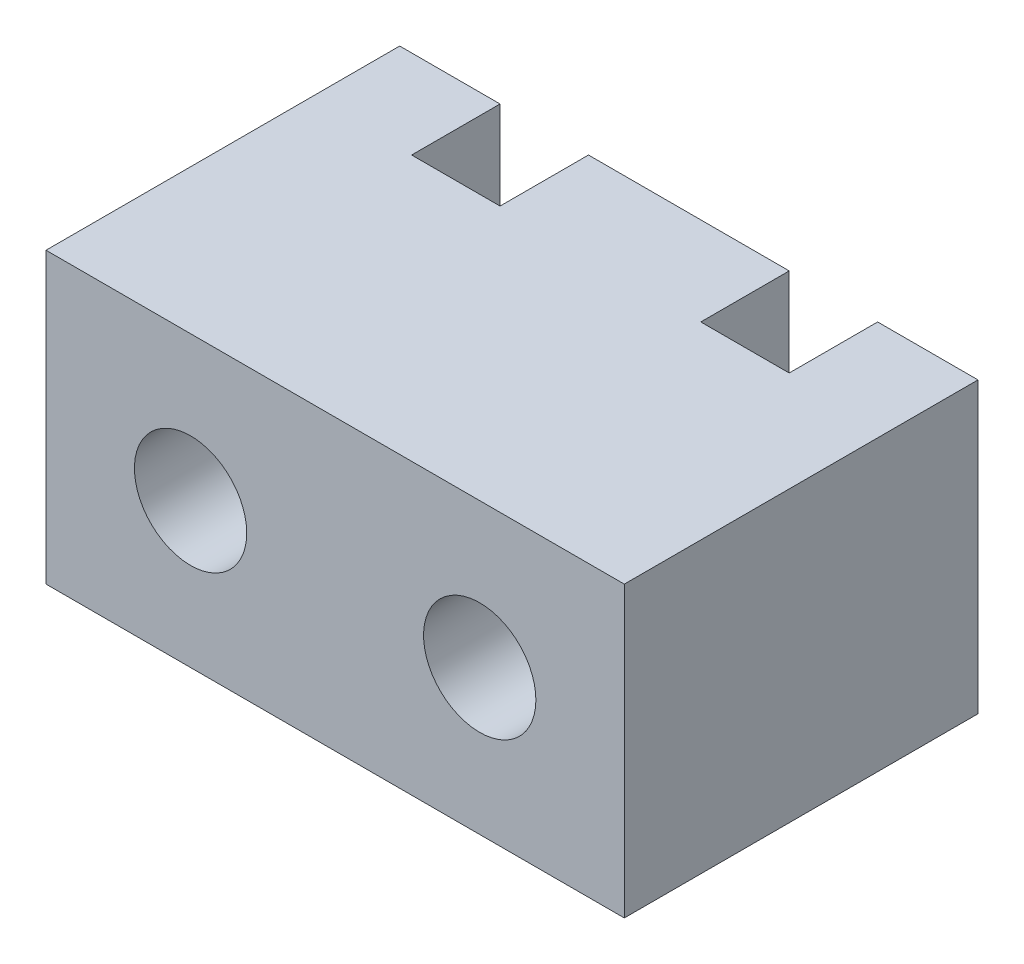
ISO-10303-21;
HEADER;
FILE_DESCRIPTION(('STEP AP214'),'2;1');
FILE_NAME('part.step','',(''),(''),'','','');
FILE_SCHEMA(('AUTOMOTIVE_DESIGN { 1 0 10303 214 1 1 1 1 }'));
ENDSEC;
DATA;
#1=APPLICATION_CONTEXT('core data for automotive mechanical design processes');
#2=APPLICATION_PROTOCOL_DEFINITION('international standard','automotive_design',2000,#1);
#3=PRODUCT_CONTEXT('',#1,'mechanical');
#4=PRODUCT('Part','Part','',(#3));
#5=PRODUCT_RELATED_PRODUCT_CATEGORY('part','',(#4));
#6=PRODUCT_DEFINITION_FORMATION('','',#4);
#7=PRODUCT_DEFINITION_CONTEXT('part definition',#1,'design');
#8=PRODUCT_DEFINITION('design','',#6,#7);
#9=PRODUCT_DEFINITION_SHAPE('','',#8);
#10=(LENGTH_UNIT() NAMED_UNIT(*) SI_UNIT(.MILLI.,.METRE.));
#11=(NAMED_UNIT(*) PLANE_ANGLE_UNIT() SI_UNIT($,.RADIAN.));
#12=(NAMED_UNIT(*) SI_UNIT($,.STERADIAN.) SOLID_ANGLE_UNIT());
#13=UNCERTAINTY_MEASURE_WITH_UNIT(LENGTH_MEASURE(1.E-05),#10,'distance_accuracy_value','');
#14=(GEOMETRIC_REPRESENTATION_CONTEXT(3) GLOBAL_UNCERTAINTY_ASSIGNED_CONTEXT((#13)) GLOBAL_UNIT_ASSIGNED_CONTEXT((#10,
#11,#12)) REPRESENTATION_CONTEXT('',''));
#15=CARTESIAN_POINT('',(0.,0.,0.));
#16=DIRECTION('',(0.,0.,1.));
#17=DIRECTION('',(1.,0.,0.));
#18=AXIS2_PLACEMENT_3D('',#15,#16,#17);
#19=CARTESIAN_POINT('',(0.,0.,-10.));
#20=DIRECTION('',(0.,0.,-1.));
#21=DIRECTION('',(-1.,0.,0.));
#22=AXIS2_PLACEMENT_3D('',#19,#20,#21);
#23=PLANE('',#22);
#24=DIRECTION('',(0.,-1.,0.));
#25=VECTOR('',#24,1.);
#26=CARTESIAN_POINT('',(10.675,8.175,-10.));
#27=LINE('',#26,#25);
#28=CARTESIAN_POINT('',(10.675,8.175,-10.));
#29=VERTEX_POINT('',#28);
#30=CARTESIAN_POINT('',(10.675,1.95719825260498,-10.));
#31=VERTEX_POINT('',#30);
#32=EDGE_CURVE('E214',#29,#31,#27,.T.);
#33=ORIENTED_EDGE('',*,*,#32,.F.);
#34=DIRECTION('',(-1.,0.,0.));
#35=VECTOR('',#34,1.);
#36=CARTESIAN_POINT('',(-16.35,8.175,-10.));
#37=LINE('',#36,#35);
#38=CARTESIAN_POINT('',(16.35,8.175,-10.));
#39=VERTEX_POINT('',#38);
#40=EDGE_CURVE('E301',#39,#29,#37,.T.);
#41=ORIENTED_EDGE('',*,*,#40,.F.);
#42=DIRECTION('',(0.,1.,0.));
#43=VECTOR('',#42,1.);
#44=CARTESIAN_POINT('',(16.35,-8.175,-10.));
#45=LINE('',#44,#43);
#46=CARTESIAN_POINT('',(16.35,-8.175,-10.));
#47=VERTEX_POINT('',#46);
#48=EDGE_CURVE('E277',#47,#39,#45,.T.);
#49=ORIENTED_EDGE('',*,*,#48,.F.);
#50=DIRECTION('',(1.,0.,0.));
#51=VECTOR('',#50,1.);
#52=CARTESIAN_POINT('',(-16.35,-8.175,-10.));
#53=LINE('',#52,#51);
#54=CARTESIAN_POINT('',(10.675,-8.175,-10.));
#55=VERTEX_POINT('',#54);
#56=EDGE_CURVE('E309',#55,#47,#53,.T.);
#57=ORIENTED_EDGE('',*,*,#56,.F.);
#58=CARTESIAN_POINT('',(10.675,-1.95719825260498,-10.));
#59=VERTEX_POINT('',#58);
#60=EDGE_CURVE('E193',#59,#55,#27,.T.);
#61=ORIENTED_EDGE('',*,*,#60,.F.);
#62=CARTESIAN_POINT('',(8.175,0.,-10.));
#63=DIRECTION('',(0.,0.,1.));
#64=DIRECTION('',(1.,0.,0.));
#65=AXIS2_PLACEMENT_3D('',#62,#63,#64);
#66=CIRCLE('',#65,3.175);
#67=EDGE_CURVE('E223',#59,#31,#66,.T.);
#68=ORIENTED_EDGE('',*,*,#67,.T.);
#69=EDGE_LOOP('',(#33,#41,#49,#57,#61,#68));
#70=FACE_BOUND('',#69,.T.);
#71=ADVANCED_FACE('F38',(#70),#23,.T.);
#72=DIRECTION('',(0.,1.,0.));
#73=VECTOR('',#72,1.);
#74=CARTESIAN_POINT('',(5.675,8.175,-10.));
#75=LINE('',#74,#73);
#76=CARTESIAN_POINT('',(5.675,-8.175,-10.));
#77=VERTEX_POINT('',#76);
#78=CARTESIAN_POINT('',(5.675,-1.95719825260498,-10.));
#79=VERTEX_POINT('',#78);
#80=EDGE_CURVE('E187',#77,#79,#75,.T.);
#81=ORIENTED_EDGE('',*,*,#80,.F.);
#82=CARTESIAN_POINT('',(-5.675,-8.175,-10.));
#83=VERTEX_POINT('',#82);
#84=EDGE_CURVE('E313',#83,#77,#53,.T.);
#85=ORIENTED_EDGE('',*,*,#84,.F.);
#86=DIRECTION('',(0.,-1.,0.));
#87=VECTOR('',#86,1.);
#88=CARTESIAN_POINT('',(-5.675,8.175,-10.));
#89=LINE('',#88,#87);
#90=CARTESIAN_POINT('',(-5.675,-1.95719825260498,-10.));
#91=VERTEX_POINT('',#90);
#92=EDGE_CURVE('E247',#91,#83,#89,.T.);
#93=ORIENTED_EDGE('',*,*,#92,.F.);
#94=CARTESIAN_POINT('',(-8.175,0.,-10.));
#95=DIRECTION('',(0.,0.,1.));
#96=DIRECTION('',(1.,0.,0.));
#97=AXIS2_PLACEMENT_3D('',#94,#95,#96);
#98=CIRCLE('',#97,3.175);
#99=CARTESIAN_POINT('',(-5.675,1.95719825260498,-10.));
#100=VERTEX_POINT('',#99);
#101=EDGE_CURVE('E268',#91,#100,#98,.T.);
#102=ORIENTED_EDGE('',*,*,#101,.T.);
#103=CARTESIAN_POINT('',(-5.675,8.175,-10.));
#104=VERTEX_POINT('',#103);
#105=EDGE_CURVE('E243',#104,#100,#89,.T.);
#106=ORIENTED_EDGE('',*,*,#105,.F.);
#107=CARTESIAN_POINT('',(5.675,8.175,-10.));
#108=VERTEX_POINT('',#107);
#109=EDGE_CURVE('E306',#108,#104,#37,.T.);
#110=ORIENTED_EDGE('',*,*,#109,.F.);
#111=CARTESIAN_POINT('',(5.675,1.95719825260498,-10.));
#112=VERTEX_POINT('',#111);
#113=EDGE_CURVE('E217',#112,#108,#75,.T.);
#114=ORIENTED_EDGE('',*,*,#113,.F.);
#115=EDGE_CURVE('E269',#112,#79,#66,.T.);
#116=ORIENTED_EDGE('',*,*,#115,.T.);
#117=EDGE_LOOP('',(#81,#85,#93,#102,#106,#110,#114,#116));
#118=FACE_BOUND('',#117,.T.);
#119=ADVANCED_FACE('F388',(#118),#23,.T.);
#120=CARTESIAN_POINT('',(0.,0.,10.));
#121=DIRECTION('',(0.,0.,-1.));
#122=DIRECTION('',(-1.,0.,0.));
#123=AXIS2_PLACEMENT_3D('',#120,#121,#122);
#124=PLANE('',#123);
#125=DIRECTION('',(0.,1.,0.));
#126=VECTOR('',#125,1.);
#127=CARTESIAN_POINT('',(16.35,-8.175,10.));
#128=LINE('',#127,#126);
#129=CARTESIAN_POINT('',(16.35,-8.175,10.));
#130=VERTEX_POINT('',#129);
#131=CARTESIAN_POINT('',(16.35,8.175,10.));
#132=VERTEX_POINT('',#131);
#133=EDGE_CURVE('E282',#130,#132,#128,.T.);
#134=ORIENTED_EDGE('',*,*,#133,.T.);
#135=DIRECTION('',(-1.,0.,0.));
#136=VECTOR('',#135,1.);
#137=CARTESIAN_POINT('',(-16.35,8.175,10.));
#138=LINE('',#137,#136);
#139=CARTESIAN_POINT('',(-16.35,8.175,10.));
#140=VERTEX_POINT('',#139);
#141=EDGE_CURVE('E286',#132,#140,#138,.T.);
#142=ORIENTED_EDGE('',*,*,#141,.T.);
#143=DIRECTION('',(0.,-1.,0.));
#144=VECTOR('',#143,1.);
#145=CARTESIAN_POINT('',(-16.35,-8.175,10.));
#146=LINE('',#145,#144);
#147=CARTESIAN_POINT('',(-16.35,-8.175,10.));
#148=VERTEX_POINT('',#147);
#149=EDGE_CURVE('E290',#140,#148,#146,.T.);
#150=ORIENTED_EDGE('',*,*,#149,.T.);
#151=DIRECTION('',(1.,0.,0.));
#152=VECTOR('',#151,1.);
#153=CARTESIAN_POINT('',(-16.35,-8.175,10.));
#154=LINE('',#153,#152);
#155=EDGE_CURVE('E293',#148,#130,#154,.T.);
#156=ORIENTED_EDGE('',*,*,#155,.T.);
#157=EDGE_LOOP('',(#134,#142,#150,#156));
#158=FACE_BOUND('',#157,.T.);
#159=CARTESIAN_POINT('',(-8.175,0.,10.));
#160=DIRECTION('',(0.,0.,1.));
#161=DIRECTION('',(1.,0.,0.));
#162=AXIS2_PLACEMENT_3D('',#159,#160,#161);
#163=CIRCLE('',#162,3.175);
#164=CARTESIAN_POINT('',(-5.,0.,10.));
#165=VERTEX_POINT('',#164);
#166=EDGE_CURVE('E273',#165,#165,#163,.T.);
#167=ORIENTED_EDGE('',*,*,#166,.F.);
#168=EDGE_LOOP('',(#167));
#169=FACE_BOUND('',#168,.T.);
#170=CARTESIAN_POINT('',(8.175,0.,10.));
#171=DIRECTION('',(0.,0.,1.));
#172=DIRECTION('',(1.,0.,0.));
#173=AXIS2_PLACEMENT_3D('',#170,#171,#172);
#174=CIRCLE('',#173,3.175);
#175=CARTESIAN_POINT('',(11.35,0.,10.));
#176=VERTEX_POINT('',#175);
#177=EDGE_CURVE('E264',#176,#176,#174,.T.);
#178=ORIENTED_EDGE('',*,*,#177,.F.);
#179=EDGE_LOOP('',(#178));
#180=FACE_BOUND('',#179,.T.);
#181=ADVANCED_FACE('F406',(#158,#169,#180),#124,.F.);
#182=DIRECTION('',(0.,1.,0.));
#183=VECTOR('',#182,1.);
#184=CARTESIAN_POINT('',(-10.675,8.175,-10.));
#185=LINE('',#184,#183);
#186=CARTESIAN_POINT('',(-10.675,-8.175,-10.));
#187=VERTEX_POINT('',#186);
#188=CARTESIAN_POINT('',(-10.675,-1.95719825260498,-10.));
#189=VERTEX_POINT('',#188);
#190=EDGE_CURVE('E248',#187,#189,#185,.T.);
#191=ORIENTED_EDGE('',*,*,#190,.F.);
#192=CARTESIAN_POINT('',(-16.35,-8.175,-10.));
#193=VERTEX_POINT('',#192);
#194=EDGE_CURVE('E287',#193,#187,#53,.T.);
#195=ORIENTED_EDGE('',*,*,#194,.F.);
#196=DIRECTION('',(0.,-1.,0.));
#197=VECTOR('',#196,1.);
#198=CARTESIAN_POINT('',(-16.35,-8.175,-10.));
#199=LINE('',#198,#197);
#200=CARTESIAN_POINT('',(-16.35,8.175,-10.));
#201=VERTEX_POINT('',#200);
#202=EDGE_CURVE('E305',#201,#193,#199,.T.);
#203=ORIENTED_EDGE('',*,*,#202,.F.);
#204=CARTESIAN_POINT('',(-10.675,8.175,-10.));
#205=VERTEX_POINT('',#204);
#206=EDGE_CURVE('E300',#205,#201,#37,.T.);
#207=ORIENTED_EDGE('',*,*,#206,.F.);
#208=CARTESIAN_POINT('',(-10.675,1.95719825260498,-10.));
#209=VERTEX_POINT('',#208);
#210=EDGE_CURVE('E246',#209,#205,#185,.T.);
#211=ORIENTED_EDGE('',*,*,#210,.F.);
#212=EDGE_CURVE('E278',#209,#189,#98,.T.);
#213=ORIENTED_EDGE('',*,*,#212,.T.);
#214=EDGE_LOOP('',(#191,#195,#203,#207,#211,#213));
#215=FACE_BOUND('',#214,.T.);
#216=ADVANCED_FACE('F414',(#215),#23,.T.);
#217=CARTESIAN_POINT('',(16.35,-8.175,10.));
#218=DIRECTION('',(-1.,0.,0.));
#219=DIRECTION('',(0.,0.,1.));
#220=AXIS2_PLACEMENT_3D('',#217,#218,#219);
#221=PLANE('',#220);
#222=ORIENTED_EDGE('',*,*,#48,.T.);
#223=DIRECTION('',(0.,0.,-1.));
#224=VECTOR('',#223,1.);
#225=CARTESIAN_POINT('',(16.35,8.175,10.));
#226=LINE('',#225,#224);
#227=EDGE_CURVE('E325',#132,#39,#226,.T.);
#228=ORIENTED_EDGE('',*,*,#227,.F.);
#229=ORIENTED_EDGE('',*,*,#133,.F.);
#230=DIRECTION('',(0.,0.,-1.));
#231=VECTOR('',#230,1.);
#232=CARTESIAN_POINT('',(16.35,-8.175,10.));
#233=LINE('',#232,#231);
#234=EDGE_CURVE('E296',#130,#47,#233,.T.);
#235=ORIENTED_EDGE('',*,*,#234,.T.);
#236=EDGE_LOOP('',(#222,#228,#229,#235));
#237=FACE_BOUND('',#236,.T.);
#238=ADVANCED_FACE('F40',(#237),#221,.F.);
#239=CARTESIAN_POINT('',(-16.35,8.175,10.));
#240=DIRECTION('',(0.,-1.,0.));
#241=DIRECTION('',(0.,0.,-1.));
#242=AXIS2_PLACEMENT_3D('',#239,#240,#241);
#243=PLANE('',#242);
#244=ORIENTED_EDGE('',*,*,#40,.T.);
#245=DIRECTION('',(0.,0.,-1.));
#246=VECTOR('',#245,1.);
#247=CARTESIAN_POINT('',(10.675,8.175,-5.));
#248=LINE('',#247,#246);
#249=CARTESIAN_POINT('',(10.675,8.175,-5.));
#250=VERTEX_POINT('',#249);
#251=EDGE_CURVE('E220',#250,#29,#248,.T.);
#252=ORIENTED_EDGE('',*,*,#251,.F.);
#253=DIRECTION('',(1.,0.,0.));
#254=VECTOR('',#253,1.);
#255=CARTESIAN_POINT('',(10.675,8.175,-5.));
#256=LINE('',#255,#254);
#257=CARTESIAN_POINT('',(5.675,8.175,-5.));
#258=VERTEX_POINT('',#257);
#259=EDGE_CURVE('E198',#258,#250,#256,.T.);
#260=ORIENTED_EDGE('',*,*,#259,.F.);
#261=DIRECTION('',(0.,0.,-1.));
#262=VECTOR('',#261,1.);
#263=CARTESIAN_POINT('',(5.675,8.175,-5.));
#264=LINE('',#263,#262);
#265=EDGE_CURVE('E224',#258,#108,#264,.T.);
#266=ORIENTED_EDGE('',*,*,#265,.T.);
#267=ORIENTED_EDGE('',*,*,#109,.T.);
#268=DIRECTION('',(0.,0.,-1.));
#269=VECTOR('',#268,1.);
#270=CARTESIAN_POINT('',(-5.675,8.175,-5.));
#271=LINE('',#270,#269);
#272=CARTESIAN_POINT('',(-5.675,8.175,-5.));
#273=VERTEX_POINT('',#272);
#274=EDGE_CURVE('E251',#273,#104,#271,.T.);
#275=ORIENTED_EDGE('',*,*,#274,.F.);
#276=DIRECTION('',(1.,0.,0.));
#277=VECTOR('',#276,1.);
#278=CARTESIAN_POINT('',(-5.675,8.175,-5.));
#279=LINE('',#278,#277);
#280=CARTESIAN_POINT('',(-10.675,8.175,-5.));
#281=VERTEX_POINT('',#280);
#282=EDGE_CURVE('E239',#281,#273,#279,.T.);
#283=ORIENTED_EDGE('',*,*,#282,.F.);
#284=DIRECTION('',(0.,0.,-1.));
#285=VECTOR('',#284,1.);
#286=CARTESIAN_POINT('',(-10.675,8.175,-5.));
#287=LINE('',#286,#285);
#288=EDGE_CURVE('E254',#281,#205,#287,.T.);
#289=ORIENTED_EDGE('',*,*,#288,.T.);
#290=ORIENTED_EDGE('',*,*,#206,.T.);
#291=DIRECTION('',(0.,0.,-1.));
#292=VECTOR('',#291,1.);
#293=CARTESIAN_POINT('',(-16.35,8.175,10.));
#294=LINE('',#293,#292);
#295=EDGE_CURVE('E321',#140,#201,#294,.T.);
#296=ORIENTED_EDGE('',*,*,#295,.F.);
#297=ORIENTED_EDGE('',*,*,#141,.F.);
#298=ORIENTED_EDGE('',*,*,#227,.T.);
#299=EDGE_LOOP('',(#244,#252,#260,#266,#267,#275,#283,#289,#290,#296,#297,#298));
#300=FACE_BOUND('',#299,.T.);
#301=ADVANCED_FACE('F402',(#300),#243,.F.);
#302=CARTESIAN_POINT('',(-16.35,-8.175,10.));
#303=DIRECTION('',(1.,0.,0.));
#304=DIRECTION('',(0.,0.,-1.));
#305=AXIS2_PLACEMENT_3D('',#302,#303,#304);
#306=PLANE('',#305);
#307=ORIENTED_EDGE('',*,*,#202,.T.);
#308=DIRECTION('',(0.,0.,-1.));
#309=VECTOR('',#308,1.);
#310=CARTESIAN_POINT('',(-16.35,-8.175,10.));
#311=LINE('',#310,#309);
#312=EDGE_CURVE('E317',#148,#193,#311,.T.);
#313=ORIENTED_EDGE('',*,*,#312,.F.);
#314=ORIENTED_EDGE('',*,*,#149,.F.);
#315=ORIENTED_EDGE('',*,*,#295,.T.);
#316=EDGE_LOOP('',(#307,#313,#314,#315));
#317=FACE_BOUND('',#316,.T.);
#318=ADVANCED_FACE('F560',(#317),#306,.F.);
#319=CARTESIAN_POINT('',(-16.35,-8.175,10.));
#320=DIRECTION('',(0.,1.,0.));
#321=DIRECTION('',(0.,0.,1.));
#322=AXIS2_PLACEMENT_3D('',#319,#320,#321);
#323=PLANE('',#322);
#324=DIRECTION('',(-1.,0.,0.));
#325=VECTOR('',#324,1.);
#326=CARTESIAN_POINT('',(10.675,-8.175,-5.));
#327=LINE('',#326,#325);
#328=CARTESIAN_POINT('',(10.675,-8.175,-5.));
#329=VERTEX_POINT('',#328);
#330=CARTESIAN_POINT('',(5.675,-8.175,-5.));
#331=VERTEX_POINT('',#330);
#332=EDGE_CURVE('E179',#329,#331,#327,.T.);
#333=ORIENTED_EDGE('',*,*,#332,.F.);
#334=DIRECTION('',(0.,0.,-1.));
#335=VECTOR('',#334,1.);
#336=CARTESIAN_POINT('',(10.675,-8.175,-5.));
#337=LINE('',#336,#335);
#338=EDGE_CURVE('E190',#329,#55,#337,.T.);
#339=ORIENTED_EDGE('',*,*,#338,.T.);
#340=ORIENTED_EDGE('',*,*,#56,.T.);
#341=ORIENTED_EDGE('',*,*,#234,.F.);
#342=ORIENTED_EDGE('',*,*,#155,.F.);
#343=ORIENTED_EDGE('',*,*,#312,.T.);
#344=ORIENTED_EDGE('',*,*,#194,.T.);
#345=DIRECTION('',(0.,0.,-1.));
#346=VECTOR('',#345,1.);
#347=CARTESIAN_POINT('',(-10.675,-8.175,-5.));
#348=LINE('',#347,#346);
#349=CARTESIAN_POINT('',(-10.675,-8.175,-5.));
#350=VERTEX_POINT('',#349);
#351=EDGE_CURVE('E258',#350,#187,#348,.T.);
#352=ORIENTED_EDGE('',*,*,#351,.F.);
#353=DIRECTION('',(-1.,0.,0.));
#354=VECTOR('',#353,1.);
#355=CARTESIAN_POINT('',(-5.675,-8.175,-5.));
#356=LINE('',#355,#354);
#357=CARTESIAN_POINT('',(-5.675,-8.175,-5.));
#358=VERTEX_POINT('',#357);
#359=EDGE_CURVE('E232',#358,#350,#356,.T.);
#360=ORIENTED_EDGE('',*,*,#359,.F.);
#361=DIRECTION('',(0.,0.,-1.));
#362=VECTOR('',#361,1.);
#363=CARTESIAN_POINT('',(-5.675,-8.175,-5.));
#364=LINE('',#363,#362);
#365=EDGE_CURVE('E242',#358,#83,#364,.T.);
#366=ORIENTED_EDGE('',*,*,#365,.T.);
#367=ORIENTED_EDGE('',*,*,#84,.T.);
#368=DIRECTION('',(0.,0.,-1.));
#369=VECTOR('',#368,1.);
#370=CARTESIAN_POINT('',(5.675,-8.175,-5.));
#371=LINE('',#370,#369);
#372=EDGE_CURVE('E197',#331,#77,#371,.T.);
#373=ORIENTED_EDGE('',*,*,#372,.F.);
#374=EDGE_LOOP('',(#333,#339,#340,#341,#342,#343,#344,#352,#360,#366,#367,#373));
#375=FACE_BOUND('',#374,.T.);
#376=ADVANCED_FACE('F200',(#375),#323,.F.);
#377=CARTESIAN_POINT('',(-8.175,0.,10.));
#378=DIRECTION('',(0.,0.,-1.));
#379=DIRECTION('',(-1.,0.,0.));
#380=AXIS2_PLACEMENT_3D('',#377,#378,#379);
#381=CYLINDRICAL_SURFACE('',#380,3.175);
#382=DIRECTION('',(0.,0.,-1.));
#383=VECTOR('',#382,1.);
#384=CARTESIAN_POINT('',(-5.675,1.95719825260498,10.));
#385=LINE('',#384,#383);
#386=CARTESIAN_POINT('',(-5.675,1.95719825260498,-5.));
#387=VERTEX_POINT('',#386);
#388=EDGE_CURVE('E11',#100,#387,#385,.F.);
#389=ORIENTED_EDGE('',*,*,#388,.F.);
#390=ORIENTED_EDGE('',*,*,#101,.F.);
#391=DIRECTION('',(0.,0.,-1.));
#392=VECTOR('',#391,1.);
#393=CARTESIAN_POINT('',(-5.675,-1.95719825260498,10.));
#394=LINE('',#393,#392);
#395=CARTESIAN_POINT('',(-5.675,-1.95719825260498,-5.));
#396=VERTEX_POINT('',#395);
#397=EDGE_CURVE('E354',#396,#91,#394,.T.);
#398=ORIENTED_EDGE('',*,*,#397,.F.);
#399=CARTESIAN_POINT('',(-8.175,0.,-5.));
#400=DIRECTION('',(0.,0.,-1.));
#401=DIRECTION('',(-1.,0.,0.));
#402=AXIS2_PLACEMENT_3D('',#399,#400,#401);
#403=CIRCLE('',#402,3.175);
#404=CARTESIAN_POINT('',(-10.675,-1.95719825260498,-5.));
#405=VERTEX_POINT('',#404);
#406=EDGE_CURVE('E346',#396,#405,#403,.T.);
#407=ORIENTED_EDGE('',*,*,#406,.T.);
#408=DIRECTION('',(0.,0.,-1.));
#409=VECTOR('',#408,1.);
#410=CARTESIAN_POINT('',(-10.675,-1.95719825260499,10.));
#411=LINE('',#410,#409);
#412=EDGE_CURVE('E350',#189,#405,#411,.F.);
#413=ORIENTED_EDGE('',*,*,#412,.F.);
#414=ORIENTED_EDGE('',*,*,#212,.F.);
#415=DIRECTION('',(0.,0.,-1.));
#416=VECTOR('',#415,1.);
#417=CARTESIAN_POINT('',(-10.675,1.95719825260498,10.));
#418=LINE('',#417,#416);
#419=CARTESIAN_POINT('',(-10.675,1.95719825260498,-5.));
#420=VERTEX_POINT('',#419);
#421=EDGE_CURVE('E47',#420,#209,#418,.T.);
#422=ORIENTED_EDGE('',*,*,#421,.F.);
#423=EDGE_CURVE('E351',#420,#387,#403,.T.);
#424=ORIENTED_EDGE('',*,*,#423,.T.);
#425=EDGE_LOOP('',(#389,#390,#398,#407,#413,#414,#422,#424));
#426=FACE_BOUND('',#425,.T.);
#427=ORIENTED_EDGE('',*,*,#166,.T.);
#428=EDGE_LOOP('',(#427));
#429=FACE_BOUND('',#428,.T.);
#430=ADVANCED_FACE('F365',(#426,#429),#381,.F.);
#431=CARTESIAN_POINT('',(8.175,0.,10.));
#432=DIRECTION('',(0.,0.,-1.));
#433=DIRECTION('',(-1.,0.,0.));
#434=AXIS2_PLACEMENT_3D('',#431,#432,#433);
#435=CYLINDRICAL_SURFACE('',#434,3.175);
#436=DIRECTION('',(0.,0.,-1.));
#437=VECTOR('',#436,1.);
#438=CARTESIAN_POINT('',(10.675,1.95719825260498,10.));
#439=LINE('',#438,#437);
#440=CARTESIAN_POINT('',(10.675,1.95719825260498,-5.));
#441=VERTEX_POINT('',#440);
#442=EDGE_CURVE('E342',#31,#441,#439,.F.);
#443=ORIENTED_EDGE('',*,*,#442,.F.);
#444=ORIENTED_EDGE('',*,*,#67,.F.);
#445=DIRECTION('',(0.,0.,-1.));
#446=VECTOR('',#445,1.);
#447=CARTESIAN_POINT('',(10.675,-1.95719825260498,10.));
#448=LINE('',#447,#446);
#449=CARTESIAN_POINT('',(10.675,-1.95719825260498,-5.));
#450=VERTEX_POINT('',#449);
#451=EDGE_CURVE('E336',#450,#59,#448,.T.);
#452=ORIENTED_EDGE('',*,*,#451,.F.);
#453=CARTESIAN_POINT('',(8.175,0.,-5.));
#454=DIRECTION('',(0.,0.,-1.));
#455=DIRECTION('',(-1.,0.,0.));
#456=AXIS2_PLACEMENT_3D('',#453,#454,#455);
#457=CIRCLE('',#456,3.175);
#458=CARTESIAN_POINT('',(5.675,-1.95719825260498,-5.));
#459=VERTEX_POINT('',#458);
#460=EDGE_CURVE('E182',#450,#459,#457,.T.);
#461=ORIENTED_EDGE('',*,*,#460,.T.);
#462=DIRECTION('',(0.,0.,-1.));
#463=VECTOR('',#462,1.);
#464=CARTESIAN_POINT('',(5.675,-1.95719825260498,10.));
#465=LINE('',#464,#463);
#466=EDGE_CURVE('E331',#79,#459,#465,.F.);
#467=ORIENTED_EDGE('',*,*,#466,.F.);
#468=ORIENTED_EDGE('',*,*,#115,.F.);
#469=DIRECTION('',(0.,0.,-1.));
#470=VECTOR('',#469,1.);
#471=CARTESIAN_POINT('',(5.675,1.95719825260498,10.));
#472=LINE('',#471,#470);
#473=CARTESIAN_POINT('',(5.675,1.95719825260498,-5.));
#474=VERTEX_POINT('',#473);
#475=EDGE_CURVE('E339',#474,#112,#472,.T.);
#476=ORIENTED_EDGE('',*,*,#475,.F.);
#477=EDGE_CURVE('E332',#474,#441,#457,.T.);
#478=ORIENTED_EDGE('',*,*,#477,.T.);
#479=EDGE_LOOP('',(#443,#444,#452,#461,#467,#468,#476,#478));
#480=FACE_BOUND('',#479,.T.);
#481=ORIENTED_EDGE('',*,*,#177,.T.);
#482=EDGE_LOOP('',(#481));
#483=FACE_BOUND('',#482,.T.);
#484=ADVANCED_FACE('F451',(#480,#483),#435,.F.);
#485=CARTESIAN_POINT('',(0.,0.,-5.));
#486=DIRECTION('',(0.,0.,-1.));
#487=DIRECTION('',(-1.,0.,0.));
#488=AXIS2_PLACEMENT_3D('',#485,#486,#487);
#489=PLANE('',#488);
#490=DIRECTION('',(0.,-1.,0.));
#491=VECTOR('',#490,1.);
#492=CARTESIAN_POINT('',(10.675,8.175,-5.));
#493=LINE('',#492,#491);
#494=EDGE_CURVE('E175',#450,#329,#493,.T.);
#495=ORIENTED_EDGE('',*,*,#494,.T.);
#496=ORIENTED_EDGE('',*,*,#332,.T.);
#497=DIRECTION('',(0.,1.,0.));
#498=VECTOR('',#497,1.);
#499=CARTESIAN_POINT('',(5.675,8.175,-5.));
#500=LINE('',#499,#498);
#501=EDGE_CURVE('E207',#331,#459,#500,.T.);
#502=ORIENTED_EDGE('',*,*,#501,.T.);
#503=ORIENTED_EDGE('',*,*,#460,.F.);
#504=EDGE_LOOP('',(#495,#496,#502,#503));
#505=FACE_BOUND('',#504,.T.);
#506=ADVANCED_FACE('F177',(#505),#489,.T.);
#507=CARTESIAN_POINT('',(5.675,8.175,-5.));
#508=DIRECTION('',(-1.,0.,0.));
#509=DIRECTION('',(0.,-1.,0.));
#510=AXIS2_PLACEMENT_3D('',#507,#508,#509);
#511=PLANE('',#510);
#512=ORIENTED_EDGE('',*,*,#466,.T.);
#513=ORIENTED_EDGE('',*,*,#501,.F.);
#514=ORIENTED_EDGE('',*,*,#372,.T.);
#515=ORIENTED_EDGE('',*,*,#80,.T.);
#516=EDGE_LOOP('',(#512,#513,#514,#515));
#517=FACE_BOUND('',#516,.T.);
#518=ADVANCED_FACE('F514',(#517),#511,.F.);
#519=CARTESIAN_POINT('',(10.675,8.175,-5.));
#520=DIRECTION('',(1.,0.,0.));
#521=DIRECTION('',(0.,1.,0.));
#522=AXIS2_PLACEMENT_3D('',#519,#520,#521);
#523=PLANE('',#522);
#524=ORIENTED_EDGE('',*,*,#451,.T.);
#525=ORIENTED_EDGE('',*,*,#60,.T.);
#526=ORIENTED_EDGE('',*,*,#338,.F.);
#527=ORIENTED_EDGE('',*,*,#494,.F.);
#528=EDGE_LOOP('',(#524,#525,#526,#527));
#529=FACE_BOUND('',#528,.T.);
#530=ADVANCED_FACE('F191',(#529),#523,.F.);
#531=ORIENTED_EDGE('',*,*,#475,.T.);
#532=ORIENTED_EDGE('',*,*,#113,.T.);
#533=ORIENTED_EDGE('',*,*,#265,.F.);
#534=EDGE_CURVE('E203',#474,#258,#500,.T.);
#535=ORIENTED_EDGE('',*,*,#534,.F.);
#536=EDGE_LOOP('',(#531,#532,#533,#535));
#537=FACE_BOUND('',#536,.T.);
#538=ADVANCED_FACE('F503',(#537),#511,.F.);
#539=ORIENTED_EDGE('',*,*,#534,.T.);
#540=ORIENTED_EDGE('',*,*,#259,.T.);
#541=EDGE_CURVE('E186',#250,#441,#493,.T.);
#542=ORIENTED_EDGE('',*,*,#541,.T.);
#543=ORIENTED_EDGE('',*,*,#477,.F.);
#544=EDGE_LOOP('',(#539,#540,#542,#543));
#545=FACE_BOUND('',#544,.T.);
#546=ADVANCED_FACE('F429',(#545),#489,.T.);
#547=ORIENTED_EDGE('',*,*,#442,.T.);
#548=ORIENTED_EDGE('',*,*,#541,.F.);
#549=ORIENTED_EDGE('',*,*,#251,.T.);
#550=ORIENTED_EDGE('',*,*,#32,.T.);
#551=EDGE_LOOP('',(#547,#548,#549,#550));
#552=FACE_BOUND('',#551,.T.);
#553=ADVANCED_FACE('F422',(#552),#523,.F.);
#554=CARTESIAN_POINT('',(0.,0.,-5.));
#555=DIRECTION('',(0.,0.,-1.));
#556=DIRECTION('',(-1.,0.,0.));
#557=AXIS2_PLACEMENT_3D('',#554,#555,#556);
#558=PLANE('',#557);
#559=DIRECTION('',(0.,-1.,0.));
#560=VECTOR('',#559,1.);
#561=CARTESIAN_POINT('',(-5.675,8.175,-5.));
#562=LINE('',#561,#560);
#563=EDGE_CURVE('E233',#396,#358,#562,.T.);
#564=ORIENTED_EDGE('',*,*,#563,.T.);
#565=ORIENTED_EDGE('',*,*,#359,.T.);
#566=DIRECTION('',(0.,1.,0.));
#567=VECTOR('',#566,1.);
#568=CARTESIAN_POINT('',(-10.675,8.175,-5.));
#569=LINE('',#568,#567);
#570=EDGE_CURVE('E61',#350,#405,#569,.T.);
#571=ORIENTED_EDGE('',*,*,#570,.T.);
#572=ORIENTED_EDGE('',*,*,#406,.F.);
#573=EDGE_LOOP('',(#564,#565,#571,#572));
#574=FACE_BOUND('',#573,.T.);
#575=ADVANCED_FACE('F420',(#574),#558,.T.);
#576=CARTESIAN_POINT('',(-10.675,8.175,-5.));
#577=DIRECTION('',(-1.,0.,0.));
#578=DIRECTION('',(0.,-1.,0.));
#579=AXIS2_PLACEMENT_3D('',#576,#577,#578);
#580=PLANE('',#579);
#581=ORIENTED_EDGE('',*,*,#412,.T.);
#582=ORIENTED_EDGE('',*,*,#570,.F.);
#583=ORIENTED_EDGE('',*,*,#351,.T.);
#584=ORIENTED_EDGE('',*,*,#190,.T.);
#585=EDGE_LOOP('',(#581,#582,#583,#584));
#586=FACE_BOUND('',#585,.T.);
#587=ADVANCED_FACE('F419',(#586),#580,.F.);
#588=CARTESIAN_POINT('',(-5.675,8.175,-5.));
#589=DIRECTION('',(1.,0.,0.));
#590=DIRECTION('',(0.,1.,0.));
#591=AXIS2_PLACEMENT_3D('',#588,#589,#590);
#592=PLANE('',#591);
#593=ORIENTED_EDGE('',*,*,#397,.T.);
#594=ORIENTED_EDGE('',*,*,#92,.T.);
#595=ORIENTED_EDGE('',*,*,#365,.F.);
#596=ORIENTED_EDGE('',*,*,#563,.F.);
#597=EDGE_LOOP('',(#593,#594,#595,#596));
#598=FACE_BOUND('',#597,.T.);
#599=ADVANCED_FACE('F380',(#598),#592,.F.);
#600=ORIENTED_EDGE('',*,*,#421,.T.);
#601=ORIENTED_EDGE('',*,*,#210,.T.);
#602=ORIENTED_EDGE('',*,*,#288,.F.);
#603=EDGE_CURVE('E236',#420,#281,#569,.T.);
#604=ORIENTED_EDGE('',*,*,#603,.F.);
#605=EDGE_LOOP('',(#600,#601,#602,#604));
#606=FACE_BOUND('',#605,.T.);
#607=ADVANCED_FACE('F371',(#606),#580,.F.);
#608=ORIENTED_EDGE('',*,*,#603,.T.);
#609=ORIENTED_EDGE('',*,*,#282,.T.);
#610=EDGE_CURVE('E54',#273,#387,#562,.T.);
#611=ORIENTED_EDGE('',*,*,#610,.T.);
#612=ORIENTED_EDGE('',*,*,#423,.F.);
#613=EDGE_LOOP('',(#608,#609,#611,#612));
#614=FACE_BOUND('',#613,.T.);
#615=ADVANCED_FACE('F369',(#614),#558,.T.);
#616=ORIENTED_EDGE('',*,*,#388,.T.);
#617=ORIENTED_EDGE('',*,*,#610,.F.);
#618=ORIENTED_EDGE('',*,*,#274,.T.);
#619=ORIENTED_EDGE('',*,*,#105,.T.);
#620=EDGE_LOOP('',(#616,#617,#618,#619));
#621=FACE_BOUND('',#620,.T.);
#622=ADVANCED_FACE('F433',(#621),#592,.F.);
#623=CLOSED_SHELL('',(#71,#119,#181,#216,#238,#301,#318,#376,#430,#484,#506,#518,#530,#538,#546,
#553,#575,#587,#599,#607,#615,#622));
#624=MANIFOLD_SOLID_BREP('B2',#623);
#625=ADVANCED_BREP_SHAPE_REPRESENTATION('',(#18,#624),#14);
#626=SHAPE_DEFINITION_REPRESENTATION(#9,#625);
ENDSEC;
END-ISO-10303-21;
